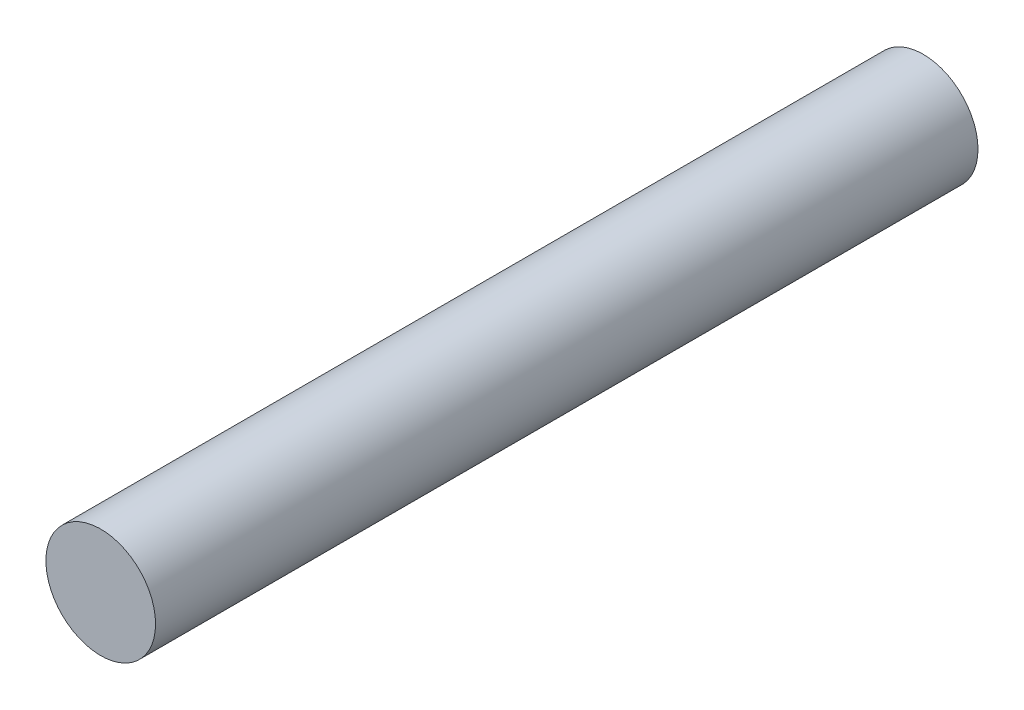
ISO-10303-21;
HEADER;
FILE_DESCRIPTION(('STEP AP214'),'2;1');
FILE_NAME('part.step','',(''),(''),'','','');
FILE_SCHEMA(('AUTOMOTIVE_DESIGN { 1 0 10303 214 1 1 1 1 }'));
ENDSEC;
DATA;
#1=APPLICATION_CONTEXT('core data for automotive mechanical design processes');
#2=APPLICATION_PROTOCOL_DEFINITION('international standard','automotive_design',2000,#1);
#3=PRODUCT_CONTEXT('',#1,'mechanical');
#4=PRODUCT('Part','Part','',(#3));
#5=PRODUCT_RELATED_PRODUCT_CATEGORY('part','',(#4));
#6=PRODUCT_DEFINITION_FORMATION('','',#4);
#7=PRODUCT_DEFINITION_CONTEXT('part definition',#1,'design');
#8=PRODUCT_DEFINITION('design','',#6,#7);
#9=PRODUCT_DEFINITION_SHAPE('','',#8);
#10=(LENGTH_UNIT() NAMED_UNIT(*) SI_UNIT(.MILLI.,.METRE.));
#11=(NAMED_UNIT(*) PLANE_ANGLE_UNIT() SI_UNIT($,.RADIAN.));
#12=(NAMED_UNIT(*) SI_UNIT($,.STERADIAN.) SOLID_ANGLE_UNIT());
#13=UNCERTAINTY_MEASURE_WITH_UNIT(LENGTH_MEASURE(1.E-05),#10,'distance_accuracy_value','');
#14=(GEOMETRIC_REPRESENTATION_CONTEXT(3) GLOBAL_UNCERTAINTY_ASSIGNED_CONTEXT((#13)) GLOBAL_UNIT_ASSIGNED_CONTEXT((#10,
#11,#12)) REPRESENTATION_CONTEXT('',''));
#15=CARTESIAN_POINT('',(0.,0.,0.));
#16=DIRECTION('',(0.,0.,1.));
#17=DIRECTION('',(1.,0.,0.));
#18=AXIS2_PLACEMENT_3D('',#15,#16,#17);
#19=CARTESIAN_POINT('',(0.,0.,150.));
#20=DIRECTION('',(0.,0.,-1.));
#21=DIRECTION('',(-1.,0.,0.));
#22=AXIS2_PLACEMENT_3D('',#19,#20,#21);
#23=CYLINDRICAL_SURFACE('',#22,10.);
#24=CARTESIAN_POINT('',(0.,0.,150.));
#25=DIRECTION('',(0.,0.,1.));
#26=DIRECTION('',(1.,0.,0.));
#27=AXIS2_PLACEMENT_3D('',#24,#25,#26);
#28=CIRCLE('',#27,10.);
#29=CARTESIAN_POINT('',(10.,0.,150.));
#30=VERTEX_POINT('',#29);
#31=EDGE_CURVE('E10',#30,#30,#28,.T.);
#32=ORIENTED_EDGE('',*,*,#31,.F.);
#33=EDGE_LOOP('',(#32));
#34=FACE_BOUND('',#33,.T.);
#35=CARTESIAN_POINT('',(0.,0.,0.));
#36=DIRECTION('',(0.,0.,1.));
#37=DIRECTION('',(1.,0.,0.));
#38=AXIS2_PLACEMENT_3D('',#35,#36,#37);
#39=CIRCLE('',#38,10.);
#40=CARTESIAN_POINT('',(10.,0.,0.));
#41=VERTEX_POINT('',#40);
#42=EDGE_CURVE('E40',#41,#41,#39,.T.);
#43=ORIENTED_EDGE('',*,*,#42,.T.);
#44=EDGE_LOOP('',(#43));
#45=FACE_BOUND('',#44,.T.);
#46=ADVANCED_FACE('F37',(#34,#45),#23,.T.);
#47=CARTESIAN_POINT('',(0.,0.,150.));
#48=DIRECTION('',(0.,0.,1.));
#49=DIRECTION('',(1.,0.,0.));
#50=AXIS2_PLACEMENT_3D('',#47,#48,#49);
#51=PLANE('',#50);
#52=ORIENTED_EDGE('',*,*,#31,.T.);
#53=EDGE_LOOP('',(#52));
#54=FACE_BOUND('',#53,.T.);
#55=ADVANCED_FACE('F52',(#54),#51,.T.);
#56=CARTESIAN_POINT('',(0.,0.,0.));
#57=DIRECTION('',(0.,0.,1.));
#58=DIRECTION('',(1.,0.,0.));
#59=AXIS2_PLACEMENT_3D('',#56,#57,#58);
#60=PLANE('',#59);
#61=ORIENTED_EDGE('',*,*,#42,.F.);
#62=EDGE_LOOP('',(#61));
#63=FACE_BOUND('',#62,.T.);
#64=ADVANCED_FACE('F50',(#63),#60,.F.);
#65=CLOSED_SHELL('',(#46,#55,#64));
#66=MANIFOLD_SOLID_BREP('B2',#65);
#67=ADVANCED_BREP_SHAPE_REPRESENTATION('',(#18,#66),#14);
#68=SHAPE_DEFINITION_REPRESENTATION(#9,#67);
ENDSEC;
END-ISO-10303-21;
